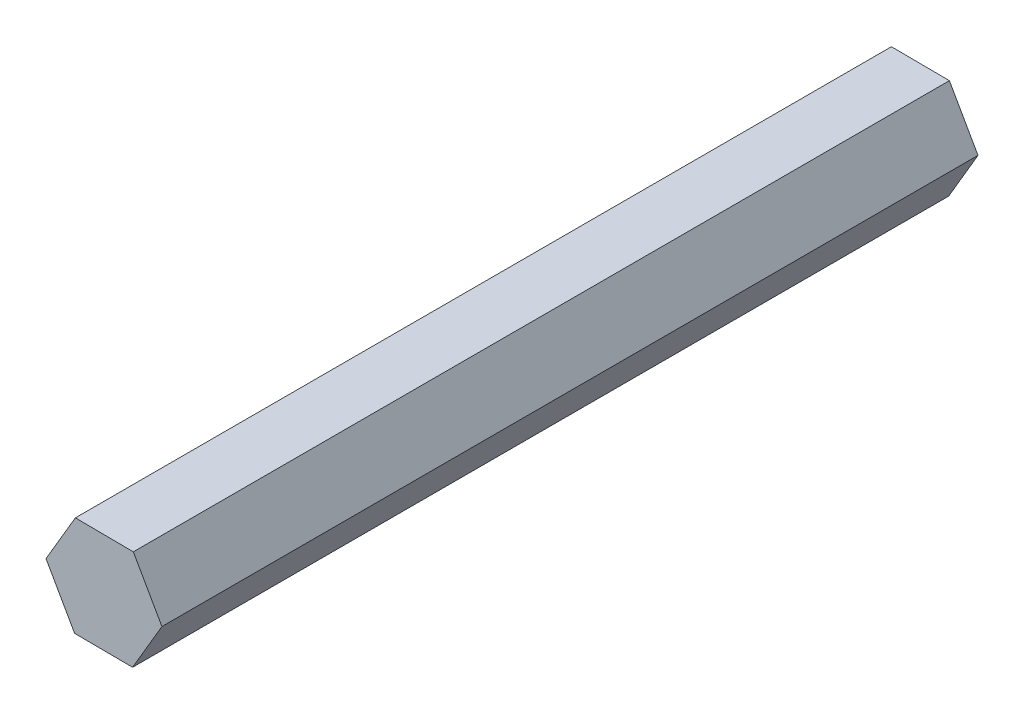
ISO-10303-21;
HEADER;
FILE_DESCRIPTION(('STEP AP214'),'2;1');
FILE_NAME('part.step','',(''),(''),'','','');
FILE_SCHEMA(('AUTOMOTIVE_DESIGN { 1 0 10303 214 1 1 1 1 }'));
ENDSEC;
DATA;
#1=APPLICATION_CONTEXT('core data for automotive mechanical design processes');
#2=APPLICATION_PROTOCOL_DEFINITION('international standard','automotive_design',2000,#1);
#3=PRODUCT_CONTEXT('',#1,'mechanical');
#4=PRODUCT('Part','Part','',(#3));
#5=PRODUCT_RELATED_PRODUCT_CATEGORY('part','',(#4));
#6=PRODUCT_DEFINITION_FORMATION('','',#4);
#7=PRODUCT_DEFINITION_CONTEXT('part definition',#1,'design');
#8=PRODUCT_DEFINITION('design','',#6,#7);
#9=PRODUCT_DEFINITION_SHAPE('','',#8);
#10=(LENGTH_UNIT() NAMED_UNIT(*) SI_UNIT(.MILLI.,.METRE.));
#11=(NAMED_UNIT(*) PLANE_ANGLE_UNIT() SI_UNIT($,.RADIAN.));
#12=(NAMED_UNIT(*) SI_UNIT($,.STERADIAN.) SOLID_ANGLE_UNIT());
#13=UNCERTAINTY_MEASURE_WITH_UNIT(LENGTH_MEASURE(1.E-05),#10,'distance_accuracy_value','');
#14=(GEOMETRIC_REPRESENTATION_CONTEXT(3) GLOBAL_UNCERTAINTY_ASSIGNED_CONTEXT((#13)) GLOBAL_UNIT_ASSIGNED_CONTEXT((#10,
#11,#12)) REPRESENTATION_CONTEXT('',''));
#15=CARTESIAN_POINT('',(0.,0.,0.));
#16=DIRECTION('',(0.,0.,1.));
#17=DIRECTION('',(1.,0.,0.));
#18=AXIS2_PLACEMENT_3D('',#15,#16,#17);
#19=CARTESIAN_POINT('',(1.46193266944427,2.48919388625011,40.64));
#20=DIRECTION('',(-0.00743877274577889,-0.999972331947258,0.));
#21=DIRECTION('',(0.999972331947258,-0.00743877274577889,0.));
#22=AXIS2_PLACEMENT_3D('',#19,#20,#21);
#23=PLANE('',#22);
#24=DIRECTION('',(-0.999972331947258,0.00743877274577889,0.));
#25=VECTOR('',#24,1.);
#26=CARTESIAN_POINT('',(1.46193266944427,2.48919388625011,0.));
#27=LINE('',#26,#25);
#28=CARTESIAN_POINT('',(1.46193266944427,2.48919388625011,0.));
#29=VERTEX_POINT('',#28);
#30=CARTESIAN_POINT('',(-1.42473880571537,2.51066777348618,0.));
#31=VERTEX_POINT('',#30);
#32=EDGE_CURVE('E128',#29,#31,#27,.T.);
#33=ORIENTED_EDGE('',*,*,#32,.T.);
#34=DIRECTION('',(0.,0.,-1.));
#35=VECTOR('',#34,1.);
#36=CARTESIAN_POINT('',(-1.42473880571537,2.51066777348618,40.64));
#37=LINE('',#36,#35);
#38=CARTESIAN_POINT('',(-1.42473880571537,2.51066777348618,40.64));
#39=VERTEX_POINT('',#38);
#40=EDGE_CURVE('E11',#39,#31,#37,.T.);
#41=ORIENTED_EDGE('',*,*,#40,.F.);
#42=DIRECTION('',(-0.999972331947258,0.00743877274577889,0.));
#43=VECTOR('',#42,1.);
#44=CARTESIAN_POINT('',(1.46193266944427,2.48919388625011,40.64));
#45=LINE('',#44,#43);
#46=CARTESIAN_POINT('',(1.46193266944427,2.48919388625011,40.64));
#47=VERTEX_POINT('',#46);
#48=EDGE_CURVE('E144',#47,#39,#45,.T.);
#49=ORIENTED_EDGE('',*,*,#48,.F.);
#50=DIRECTION('',(0.,0.,-1.));
#51=VECTOR('',#50,1.);
#52=CARTESIAN_POINT('',(1.46193266944427,2.48919388625011,40.64));
#53=LINE('',#52,#51);
#54=EDGE_CURVE('E124',#47,#29,#53,.T.);
#55=ORIENTED_EDGE('',*,*,#54,.T.);
#56=EDGE_LOOP('',(#33,#41,#49,#55));
#57=FACE_BOUND('',#56,.T.);
#58=ADVANCED_FACE('F39',(#57),#23,.F.);
#59=CARTESIAN_POINT('',(-1.42473880571537,2.51066777348618,40.64));
#60=DIRECTION('',(0.862282056175001,-0.506428332144453,0.));
#61=DIRECTION('',(0.506428332144453,0.862282056175001,0.));
#62=AXIS2_PLACEMENT_3D('',#59,#60,#61);
#63=PLANE('',#62);
#64=DIRECTION('',(-0.506428332144453,-0.862282056175001,0.));
#65=VECTOR('',#64,1.);
#66=CARTESIAN_POINT('',(-1.42473880571537,2.51066777348618,0.));
#67=LINE('',#66,#65);
#68=CARTESIAN_POINT('',(-2.88667147515964,0.0214738872360797,0.));
#69=VERTEX_POINT('',#68);
#70=EDGE_CURVE('E132',#31,#69,#67,.T.);
#71=ORIENTED_EDGE('',*,*,#70,.T.);
#72=DIRECTION('',(0.,0.,-1.));
#73=VECTOR('',#72,1.);
#74=CARTESIAN_POINT('',(-2.88667147515964,0.0214738872360797,40.64));
#75=LINE('',#74,#73);
#76=CARTESIAN_POINT('',(-2.88667147515964,0.0214738872360797,40.64));
#77=VERTEX_POINT('',#76);
#78=EDGE_CURVE('E48',#77,#69,#75,.T.);
#79=ORIENTED_EDGE('',*,*,#78,.F.);
#80=DIRECTION('',(-0.506428332144453,-0.862282056175001,0.));
#81=VECTOR('',#80,1.);
#82=CARTESIAN_POINT('',(-1.42473880571537,2.51066777348618,40.64));
#83=LINE('',#82,#81);
#84=EDGE_CURVE('E93',#39,#77,#83,.T.);
#85=ORIENTED_EDGE('',*,*,#84,.F.);
#86=ORIENTED_EDGE('',*,*,#40,.T.);
#87=EDGE_LOOP('',(#71,#79,#85,#86));
#88=FACE_BOUND('',#87,.T.);
#89=ADVANCED_FACE('F172',(#88),#63,.F.);
#90=CARTESIAN_POINT('',(-2.88667147515964,0.0214738872360797,40.64));
#91=DIRECTION('',(0.86972082892078,0.493543999802805,0.));
#92=DIRECTION('',(-0.493543999802805,0.86972082892078,0.));
#93=AXIS2_PLACEMENT_3D('',#90,#91,#92);
#94=PLANE('',#93);
#95=DIRECTION('',(0.493543999802805,-0.86972082892078,0.));
#96=VECTOR('',#95,1.);
#97=CARTESIAN_POINT('',(-2.88667147515964,0.0214738872360797,0.));
#98=LINE('',#97,#96);
#99=CARTESIAN_POINT('',(-1.46193266944426,-2.4891938862501,0.));
#100=VERTEX_POINT('',#99);
#101=EDGE_CURVE('E135',#69,#100,#98,.T.);
#102=ORIENTED_EDGE('',*,*,#101,.T.);
#103=DIRECTION('',(0.,0.,-1.));
#104=VECTOR('',#103,1.);
#105=CARTESIAN_POINT('',(-1.46193266944426,-2.4891938862501,40.64));
#106=LINE('',#105,#104);
#107=CARTESIAN_POINT('',(-1.46193266944426,-2.4891938862501,40.64));
#108=VERTEX_POINT('',#107);
#109=EDGE_CURVE('E117',#108,#100,#106,.T.);
#110=ORIENTED_EDGE('',*,*,#109,.F.);
#111=DIRECTION('',(0.493543999802805,-0.86972082892078,0.));
#112=VECTOR('',#111,1.);
#113=CARTESIAN_POINT('',(-2.88667147515964,0.0214738872360797,40.64));
#114=LINE('',#113,#112);
#115=EDGE_CURVE('E106',#77,#108,#114,.T.);
#116=ORIENTED_EDGE('',*,*,#115,.F.);
#117=ORIENTED_EDGE('',*,*,#78,.T.);
#118=EDGE_LOOP('',(#102,#110,#116,#117));
#119=FACE_BOUND('',#118,.T.);
#120=ADVANCED_FACE('F154',(#119),#94,.F.);
#121=CARTESIAN_POINT('',(-1.46193266944426,-2.4891938862501,40.64));
#122=DIRECTION('',(0.00743877274577919,0.999972331947258,0.));
#123=DIRECTION('',(-0.999972331947258,0.00743877274577919,0.));
#124=AXIS2_PLACEMENT_3D('',#121,#122,#123);
#125=PLANE('',#124);
#126=DIRECTION('',(0.999972331947258,-0.00743877274577919,0.));
#127=VECTOR('',#126,1.);
#128=CARTESIAN_POINT('',(-1.46193266944426,-2.4891938862501,0.));
#129=LINE('',#128,#127);
#130=CARTESIAN_POINT('',(1.42473880571537,-2.51066777348619,0.));
#131=VERTEX_POINT('',#130);
#132=EDGE_CURVE('E115',#100,#131,#129,.T.);
#133=ORIENTED_EDGE('',*,*,#132,.T.);
#134=DIRECTION('',(0.,0.,-1.));
#135=VECTOR('',#134,1.);
#136=CARTESIAN_POINT('',(1.42473880571537,-2.51066777348619,40.64));
#137=LINE('',#136,#135);
#138=CARTESIAN_POINT('',(1.42473880571537,-2.51066777348619,40.64));
#139=VERTEX_POINT('',#138);
#140=EDGE_CURVE('E112',#139,#131,#137,.T.);
#141=ORIENTED_EDGE('',*,*,#140,.F.);
#142=DIRECTION('',(0.999972331947258,-0.00743877274577919,0.));
#143=VECTOR('',#142,1.);
#144=CARTESIAN_POINT('',(-1.46193266944426,-2.4891938862501,40.64));
#145=LINE('',#144,#143);
#146=EDGE_CURVE('E100',#108,#139,#145,.T.);
#147=ORIENTED_EDGE('',*,*,#146,.F.);
#148=ORIENTED_EDGE('',*,*,#109,.T.);
#149=EDGE_LOOP('',(#133,#141,#147,#148));
#150=FACE_BOUND('',#149,.T.);
#151=ADVANCED_FACE('F113',(#150),#125,.F.);
#152=CARTESIAN_POINT('',(1.42473880571537,-2.51066777348619,40.64));
#153=DIRECTION('',(-0.862282056175001,0.506428332144453,0.));
#154=DIRECTION('',(-0.506428332144453,-0.862282056175001,0.));
#155=AXIS2_PLACEMENT_3D('',#152,#153,#154);
#156=PLANE('',#155);
#157=DIRECTION('',(0.506428332144453,0.862282056175001,0.));
#158=VECTOR('',#157,1.);
#159=CARTESIAN_POINT('',(1.42473880571537,-2.51066777348619,0.));
#160=LINE('',#159,#158);
#161=CARTESIAN_POINT('',(2.88667147515964,-0.0214738872360792,0.));
#162=VERTEX_POINT('',#161);
#163=EDGE_CURVE('E79',#131,#162,#160,.T.);
#164=ORIENTED_EDGE('',*,*,#163,.T.);
#165=DIRECTION('',(0.,0.,-1.));
#166=VECTOR('',#165,1.);
#167=CARTESIAN_POINT('',(2.88667147515964,-0.0214738872360792,40.64));
#168=LINE('',#167,#166);
#169=CARTESIAN_POINT('',(2.88667147515964,-0.0214738872360792,40.64));
#170=VERTEX_POINT('',#169);
#171=EDGE_CURVE('E118',#170,#162,#168,.T.);
#172=ORIENTED_EDGE('',*,*,#171,.F.);
#173=DIRECTION('',(0.506428332144453,0.862282056175001,0.));
#174=VECTOR('',#173,1.);
#175=CARTESIAN_POINT('',(1.42473880571537,-2.51066777348619,40.64));
#176=LINE('',#175,#174);
#177=EDGE_CURVE('E104',#139,#170,#176,.T.);
#178=ORIENTED_EDGE('',*,*,#177,.F.);
#179=ORIENTED_EDGE('',*,*,#140,.T.);
#180=EDGE_LOOP('',(#164,#172,#178,#179));
#181=FACE_BOUND('',#180,.T.);
#182=ADVANCED_FACE('F120',(#181),#156,.F.);
#183=CARTESIAN_POINT('',(2.88667147515964,-0.0214738872360792,40.64));
#184=DIRECTION('',(-0.86972082892078,-0.493543999802805,0.));
#185=DIRECTION('',(0.493543999802805,-0.86972082892078,0.));
#186=AXIS2_PLACEMENT_3D('',#183,#184,#185);
#187=PLANE('',#186);
#188=DIRECTION('',(-0.493543999802805,0.86972082892078,0.));
#189=VECTOR('',#188,1.);
#190=CARTESIAN_POINT('',(2.88667147515964,-0.0214738872360792,0.));
#191=LINE('',#190,#189);
#192=EDGE_CURVE('E85',#162,#29,#191,.T.);
#193=ORIENTED_EDGE('',*,*,#192,.T.);
#194=ORIENTED_EDGE('',*,*,#54,.F.);
#195=DIRECTION('',(-0.493543999802805,0.86972082892078,0.));
#196=VECTOR('',#195,1.);
#197=CARTESIAN_POINT('',(2.88667147515964,-0.0214738872360792,40.64));
#198=LINE('',#197,#196);
#199=EDGE_CURVE('E56',#170,#47,#198,.T.);
#200=ORIENTED_EDGE('',*,*,#199,.F.);
#201=ORIENTED_EDGE('',*,*,#171,.T.);
#202=EDGE_LOOP('',(#193,#194,#200,#201));
#203=FACE_BOUND('',#202,.T.);
#204=ADVANCED_FACE('F161',(#203),#187,.F.);
#205=CARTESIAN_POINT('',(0.,0.,40.64));
#206=DIRECTION('',(0.,0.,1.));
#207=DIRECTION('',(1.,0.,0.));
#208=AXIS2_PLACEMENT_3D('',#205,#206,#207);
#209=PLANE('',#208);
#210=ORIENTED_EDGE('',*,*,#48,.T.);
#211=ORIENTED_EDGE('',*,*,#84,.T.);
#212=ORIENTED_EDGE('',*,*,#115,.T.);
#213=ORIENTED_EDGE('',*,*,#146,.T.);
#214=ORIENTED_EDGE('',*,*,#177,.T.);
#215=ORIENTED_EDGE('',*,*,#199,.T.);
#216=EDGE_LOOP('',(#210,#211,#212,#213,#214,#215));
#217=FACE_BOUND('',#216,.T.);
#218=ADVANCED_FACE('F102',(#217),#209,.T.);
#219=CARTESIAN_POINT('',(0.,0.,0.));
#220=DIRECTION('',(0.,0.,1.));
#221=DIRECTION('',(1.,0.,0.));
#222=AXIS2_PLACEMENT_3D('',#219,#220,#221);
#223=PLANE('',#222);
#224=ORIENTED_EDGE('',*,*,#32,.F.);
#225=ORIENTED_EDGE('',*,*,#192,.F.);
#226=ORIENTED_EDGE('',*,*,#163,.F.);
#227=ORIENTED_EDGE('',*,*,#132,.F.);
#228=ORIENTED_EDGE('',*,*,#101,.F.);
#229=ORIENTED_EDGE('',*,*,#70,.F.);
#230=EDGE_LOOP('',(#224,#225,#226,#227,#228,#229));
#231=FACE_BOUND('',#230,.T.);
#232=ADVANCED_FACE('F157',(#231),#223,.F.);
#233=CLOSED_SHELL('',(#58,#89,#120,#151,#182,#204,#218,#232));
#234=MANIFOLD_SOLID_BREP('B2',#233);
#235=ADVANCED_BREP_SHAPE_REPRESENTATION('',(#18,#234),#14);
#236=SHAPE_DEFINITION_REPRESENTATION(#9,#235);
ENDSEC;
END-ISO-10303-21;
